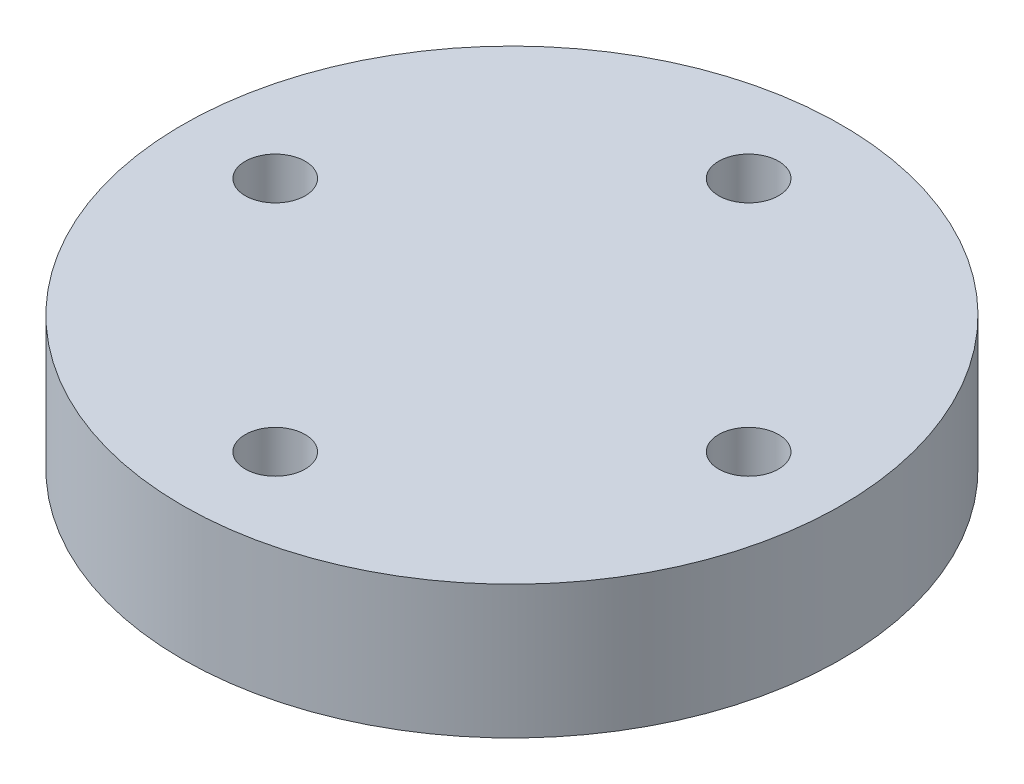
ISO-10303-21;
HEADER;
FILE_DESCRIPTION(('STEP AP214'),'2;1');
FILE_NAME('part.step','',(''),(''),'','','');
FILE_SCHEMA(('AUTOMOTIVE_DESIGN { 1 0 10303 214 1 1 1 1 }'));
ENDSEC;
DATA;
#1=APPLICATION_CONTEXT('core data for automotive mechanical design processes');
#2=APPLICATION_PROTOCOL_DEFINITION('international standard','automotive_design',2000,#1);
#3=PRODUCT_CONTEXT('',#1,'mechanical');
#4=PRODUCT('Part','Part','',(#3));
#5=PRODUCT_RELATED_PRODUCT_CATEGORY('part','',(#4));
#6=PRODUCT_DEFINITION_FORMATION('','',#4);
#7=PRODUCT_DEFINITION_CONTEXT('part definition',#1,'design');
#8=PRODUCT_DEFINITION('design','',#6,#7);
#9=PRODUCT_DEFINITION_SHAPE('','',#8);
#10=(LENGTH_UNIT() NAMED_UNIT(*) SI_UNIT(.MILLI.,.METRE.));
#11=(NAMED_UNIT(*) PLANE_ANGLE_UNIT() SI_UNIT($,.RADIAN.));
#12=(NAMED_UNIT(*) SI_UNIT($,.STERADIAN.) SOLID_ANGLE_UNIT());
#13=UNCERTAINTY_MEASURE_WITH_UNIT(LENGTH_MEASURE(1.E-05),#10,'distance_accuracy_value','');
#14=(GEOMETRIC_REPRESENTATION_CONTEXT(3) GLOBAL_UNCERTAINTY_ASSIGNED_CONTEXT((#13)) GLOBAL_UNIT_ASSIGNED_CONTEXT((#10,
#11,#12)) REPRESENTATION_CONTEXT('',''));
#15=CARTESIAN_POINT('',(0.,0.,0.));
#16=DIRECTION('',(0.,0.,1.));
#17=DIRECTION('',(1.,0.,0.));
#18=AXIS2_PLACEMENT_3D('',#15,#16,#17);
#19=CARTESIAN_POINT('',(0.,4.445,0.));
#20=DIRECTION('',(0.,-1.,0.));
#21=DIRECTION('',(0.,0.,-1.));
#22=AXIS2_PLACEMENT_3D('',#19,#20,#21);
#23=CYLINDRICAL_SURFACE('',#22,11.);
#24=CARTESIAN_POINT('',(0.,4.445,0.));
#25=DIRECTION('',(0.,1.,0.));
#26=DIRECTION('',(0.,0.,1.));
#27=AXIS2_PLACEMENT_3D('',#24,#25,#26);
#28=CIRCLE('',#27,11.);
#29=CARTESIAN_POINT('',(0.,4.445,11.));
#30=VERTEX_POINT('',#29);
#31=EDGE_CURVE('E10',#30,#30,#28,.T.);
#32=ORIENTED_EDGE('',*,*,#31,.F.);
#33=EDGE_LOOP('',(#32));
#34=FACE_BOUND('',#33,.T.);
#35=CARTESIAN_POINT('',(0.,0.,0.));
#36=DIRECTION('',(0.,1.,0.));
#37=DIRECTION('',(0.,0.,1.));
#38=AXIS2_PLACEMENT_3D('',#35,#36,#37);
#39=CIRCLE('',#38,11.);
#40=CARTESIAN_POINT('',(0.,0.,11.));
#41=VERTEX_POINT('',#40);
#42=EDGE_CURVE('E34',#41,#41,#39,.T.);
#43=ORIENTED_EDGE('',*,*,#42,.T.);
#44=EDGE_LOOP('',(#43));
#45=FACE_BOUND('',#44,.T.);
#46=ADVANCED_FACE('F31',(#34,#45),#23,.T.);
#47=CARTESIAN_POINT('',(0.,4.445,0.));
#48=DIRECTION('',(0.,1.,0.));
#49=DIRECTION('',(0.,0.,1.));
#50=AXIS2_PLACEMENT_3D('',#47,#48,#49);
#51=PLANE('',#50);
#52=CARTESIAN_POINT('',(0.,4.445,7.9));
#53=DIRECTION('',(0.,1.,0.));
#54=DIRECTION('',(0.,0.,-1.));
#55=AXIS2_PLACEMENT_3D('',#52,#53,#54);
#56=CIRCLE('',#55,0.999999999999999);
#57=CARTESIAN_POINT('',(0.,4.445,6.9));
#58=VERTEX_POINT('',#57);
#59=EDGE_CURVE('E61',#58,#58,#56,.T.);
#60=ORIENTED_EDGE('',*,*,#59,.F.);
#61=EDGE_LOOP('',(#60));
#62=FACE_BOUND('',#61,.T.);
#63=CARTESIAN_POINT('',(-7.9,4.445,0.));
#64=DIRECTION('',(0.,1.,0.));
#65=DIRECTION('',(1.,0.,0.));
#66=AXIS2_PLACEMENT_3D('',#63,#64,#65);
#67=CIRCLE('',#66,0.999999999999999);
#68=CARTESIAN_POINT('',(-6.9,4.445,0.));
#69=VERTEX_POINT('',#68);
#70=EDGE_CURVE('E55',#69,#69,#67,.T.);
#71=ORIENTED_EDGE('',*,*,#70,.F.);
#72=EDGE_LOOP('',(#71));
#73=FACE_BOUND('',#72,.T.);
#74=CARTESIAN_POINT('',(7.9,4.445,0.));
#75=DIRECTION('',(0.,1.,0.));
#76=DIRECTION('',(-1.,0.,0.));
#77=AXIS2_PLACEMENT_3D('',#74,#75,#76);
#78=CIRCLE('',#77,0.999999999999999);
#79=CARTESIAN_POINT('',(6.9,4.445,0.));
#80=VERTEX_POINT('',#79);
#81=EDGE_CURVE('E49',#80,#80,#78,.T.);
#82=ORIENTED_EDGE('',*,*,#81,.F.);
#83=EDGE_LOOP('',(#82));
#84=FACE_BOUND('',#83,.T.);
#85=CARTESIAN_POINT('',(0.,4.445,-7.9));
#86=DIRECTION('',(0.,1.,0.));
#87=DIRECTION('',(0.,0.,1.));
#88=AXIS2_PLACEMENT_3D('',#85,#86,#87);
#89=CIRCLE('',#88,0.999999999999999);
#90=CARTESIAN_POINT('',(0.,4.445,-6.9));
#91=VERTEX_POINT('',#90);
#92=EDGE_CURVE('E43',#91,#91,#89,.T.);
#93=ORIENTED_EDGE('',*,*,#92,.F.);
#94=EDGE_LOOP('',(#93));
#95=FACE_BOUND('',#94,.T.);
#96=ORIENTED_EDGE('',*,*,#31,.T.);
#97=EDGE_LOOP('',(#96));
#98=FACE_BOUND('',#97,.T.);
#99=ADVANCED_FACE('F77',(#62,#73,#84,#95,#98),#51,.T.);
#100=CARTESIAN_POINT('',(0.,0.,0.));
#101=DIRECTION('',(0.,1.,0.));
#102=DIRECTION('',(0.,0.,1.));
#103=AXIS2_PLACEMENT_3D('',#100,#101,#102);
#104=PLANE('',#103);
#105=CARTESIAN_POINT('',(0.,0.,7.9));
#106=DIRECTION('',(0.,1.,0.));
#107=DIRECTION('',(0.,0.,-1.));
#108=AXIS2_PLACEMENT_3D('',#105,#106,#107);
#109=CIRCLE('',#108,0.999999999999999);
#110=CARTESIAN_POINT('',(0.,0.,6.9));
#111=VERTEX_POINT('',#110);
#112=EDGE_CURVE('E52',#111,#111,#109,.T.);
#113=ORIENTED_EDGE('',*,*,#112,.T.);
#114=EDGE_LOOP('',(#113));
#115=FACE_BOUND('',#114,.T.);
#116=CARTESIAN_POINT('',(-7.9,0.,0.));
#117=DIRECTION('',(0.,1.,0.));
#118=DIRECTION('',(1.,0.,0.));
#119=AXIS2_PLACEMENT_3D('',#116,#117,#118);
#120=CIRCLE('',#119,0.999999999999999);
#121=CARTESIAN_POINT('',(-6.9,0.,0.));
#122=VERTEX_POINT('',#121);
#123=EDGE_CURVE('E58',#122,#122,#120,.T.);
#124=ORIENTED_EDGE('',*,*,#123,.T.);
#125=EDGE_LOOP('',(#124));
#126=FACE_BOUND('',#125,.T.);
#127=CARTESIAN_POINT('',(7.9,0.,0.));
#128=DIRECTION('',(0.,1.,0.));
#129=DIRECTION('',(-1.,0.,0.));
#130=AXIS2_PLACEMENT_3D('',#127,#128,#129);
#131=CIRCLE('',#130,0.999999999999999);
#132=CARTESIAN_POINT('',(6.9,0.,0.));
#133=VERTEX_POINT('',#132);
#134=EDGE_CURVE('E46',#133,#133,#131,.T.);
#135=ORIENTED_EDGE('',*,*,#134,.T.);
#136=EDGE_LOOP('',(#135));
#137=FACE_BOUND('',#136,.T.);
#138=CARTESIAN_POINT('',(0.,0.,-7.9));
#139=DIRECTION('',(0.,1.,0.));
#140=DIRECTION('',(0.,0.,1.));
#141=AXIS2_PLACEMENT_3D('',#138,#139,#140);
#142=CIRCLE('',#141,0.999999999999999);
#143=CARTESIAN_POINT('',(0.,0.,-6.9));
#144=VERTEX_POINT('',#143);
#145=EDGE_CURVE('E41',#144,#144,#142,.T.);
#146=ORIENTED_EDGE('',*,*,#145,.T.);
#147=EDGE_LOOP('',(#146));
#148=FACE_BOUND('',#147,.T.);
#149=ORIENTED_EDGE('',*,*,#42,.F.);
#150=EDGE_LOOP('',(#149));
#151=FACE_BOUND('',#150,.T.);
#152=ADVANCED_FACE('F67',(#115,#126,#137,#148,#151),#104,.F.);
#153=CARTESIAN_POINT('',(0.,0.,-7.9));
#154=DIRECTION('',(0.,1.,0.));
#155=DIRECTION('',(0.,0.,1.));
#156=AXIS2_PLACEMENT_3D('',#153,#154,#155);
#157=CYLINDRICAL_SURFACE('',#156,0.999999999999999);
#158=ORIENTED_EDGE('',*,*,#145,.F.);
#159=EDGE_LOOP('',(#158));
#160=FACE_BOUND('',#159,.T.);
#161=ORIENTED_EDGE('',*,*,#92,.T.);
#162=EDGE_LOOP('',(#161));
#163=FACE_BOUND('',#162,.T.);
#164=ADVANCED_FACE('F87',(#160,#163),#157,.F.);
#165=CARTESIAN_POINT('',(7.9,0.,0.));
#166=DIRECTION('',(0.,1.,0.));
#167=DIRECTION('',(0.,0.,1.));
#168=AXIS2_PLACEMENT_3D('',#165,#166,#167);
#169=CYLINDRICAL_SURFACE('',#168,0.999999999999999);
#170=ORIENTED_EDGE('',*,*,#134,.F.);
#171=EDGE_LOOP('',(#170));
#172=FACE_BOUND('',#171,.T.);
#173=ORIENTED_EDGE('',*,*,#81,.T.);
#174=EDGE_LOOP('',(#173));
#175=FACE_BOUND('',#174,.T.);
#176=ADVANCED_FACE('F89',(#172,#175),#169,.F.);
#177=CARTESIAN_POINT('',(-7.9,0.,0.));
#178=DIRECTION('',(0.,1.,0.));
#179=DIRECTION('',(0.,0.,1.));
#180=AXIS2_PLACEMENT_3D('',#177,#178,#179);
#181=CYLINDRICAL_SURFACE('',#180,0.999999999999999);
#182=ORIENTED_EDGE('',*,*,#123,.F.);
#183=EDGE_LOOP('',(#182));
#184=FACE_BOUND('',#183,.T.);
#185=ORIENTED_EDGE('',*,*,#70,.T.);
#186=EDGE_LOOP('',(#185));
#187=FACE_BOUND('',#186,.T.);
#188=ADVANCED_FACE('F73',(#184,#187),#181,.F.);
#189=CARTESIAN_POINT('',(0.,0.,7.9));
#190=DIRECTION('',(0.,1.,0.));
#191=DIRECTION('',(0.,0.,1.));
#192=AXIS2_PLACEMENT_3D('',#189,#190,#191);
#193=CYLINDRICAL_SURFACE('',#192,0.999999999999999);
#194=ORIENTED_EDGE('',*,*,#112,.F.);
#195=EDGE_LOOP('',(#194));
#196=FACE_BOUND('',#195,.T.);
#197=ORIENTED_EDGE('',*,*,#59,.T.);
#198=EDGE_LOOP('',(#197));
#199=FACE_BOUND('',#198,.T.);
#200=ADVANCED_FACE('F70',(#196,#199),#193,.F.);
#201=CLOSED_SHELL('',(#46,#99,#152,#164,#176,#188,#200));
#202=MANIFOLD_SOLID_BREP('B2',#201);
#203=ADVANCED_BREP_SHAPE_REPRESENTATION('',(#18,#202),#14);
#204=SHAPE_DEFINITION_REPRESENTATION(#9,#203);
ENDSEC;
END-ISO-10303-21;
